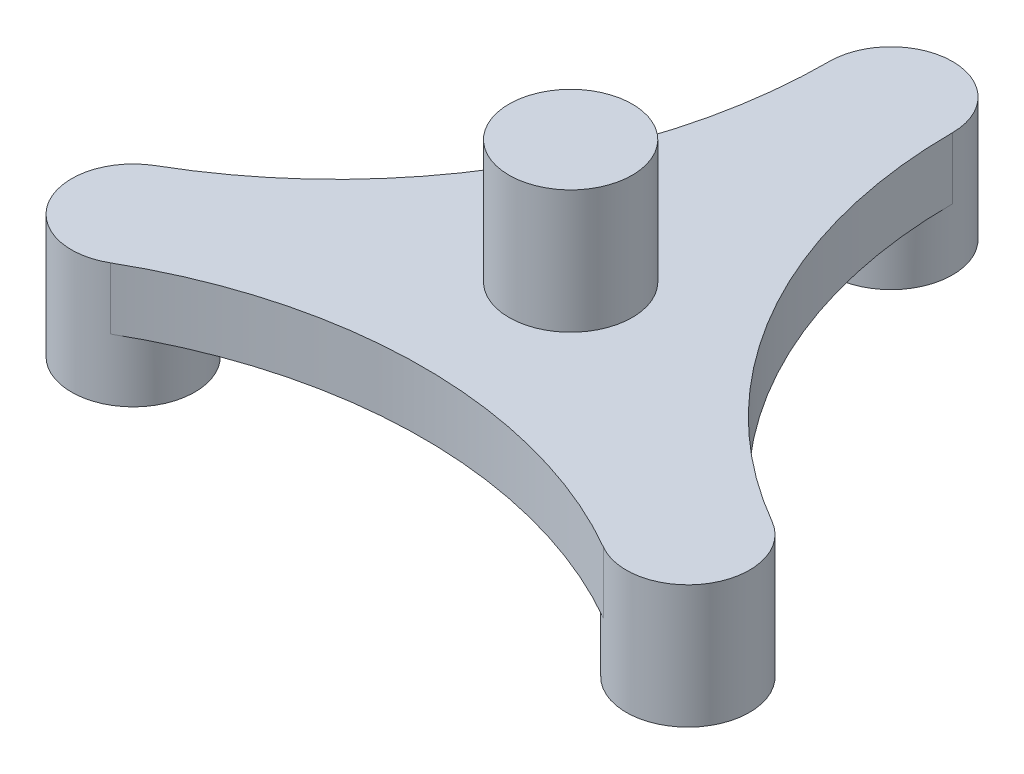
ISO-10303-21;
HEADER;
FILE_DESCRIPTION(('STEP AP214'),'2;1');
FILE_NAME('part.step','',(''),(''),'','','');
FILE_SCHEMA(('AUTOMOTIVE_DESIGN { 1 0 10303 214 1 1 1 1 }'));
ENDSEC;
DATA;
#1=APPLICATION_CONTEXT('core data for automotive mechanical design processes');
#2=APPLICATION_PROTOCOL_DEFINITION('international standard','automotive_design',2000,#1);
#3=PRODUCT_CONTEXT('',#1,'mechanical');
#4=PRODUCT('Part','Part','',(#3));
#5=PRODUCT_RELATED_PRODUCT_CATEGORY('part','',(#4));
#6=PRODUCT_DEFINITION_FORMATION('','',#4);
#7=PRODUCT_DEFINITION_CONTEXT('part definition',#1,'design');
#8=PRODUCT_DEFINITION('design','',#6,#7);
#9=PRODUCT_DEFINITION_SHAPE('','',#8);
#10=(LENGTH_UNIT() NAMED_UNIT(*) SI_UNIT(.MILLI.,.METRE.));
#11=(NAMED_UNIT(*) PLANE_ANGLE_UNIT() SI_UNIT($,.RADIAN.));
#12=(NAMED_UNIT(*) SI_UNIT($,.STERADIAN.) SOLID_ANGLE_UNIT());
#13=UNCERTAINTY_MEASURE_WITH_UNIT(LENGTH_MEASURE(1.E-05),#10,'distance_accuracy_value','');
#14=(GEOMETRIC_REPRESENTATION_CONTEXT(3) GLOBAL_UNCERTAINTY_ASSIGNED_CONTEXT((#13)) GLOBAL_UNIT_ASSIGNED_CONTEXT((#10,
#11,#12)) REPRESENTATION_CONTEXT('',''));
#15=CARTESIAN_POINT('',(0.,0.,0.));
#16=DIRECTION('',(0.,0.,1.));
#17=DIRECTION('',(1.,0.,0.));
#18=AXIS2_PLACEMENT_3D('',#15,#16,#17);
#19=CARTESIAN_POINT('',(-57.15,0.,-65.9911357683742));
#20=DIRECTION('',(0.,1.,0.));
#21=DIRECTION('',(0.,0.,1.));
#22=AXIS2_PLACEMENT_3D('',#19,#20,#21);
#23=PLANE('',#22);
#24=CARTESIAN_POINT('',(0.,0.,-65.9911357683742));
#25=DIRECTION('',(0.,-1.,0.));
#26=DIRECTION('',(0.,0.,-1.));
#27=AXIS2_PLACEMENT_3D('',#24,#25,#26);
#28=CIRCLE('',#27,12.7);
#29=CARTESIAN_POINT('',(12.7,0.,-65.9911357683742));
#30=VERTEX_POINT('',#29);
#31=CARTESIAN_POINT('',(-12.7,0.,-65.9911357683742));
#32=VERTEX_POINT('',#31);
#33=EDGE_CURVE('E77',#30,#32,#28,.T.);
#34=ORIENTED_EDGE('',*,*,#33,.F.);
#35=CARTESIAN_POINT('',(114.3,0.,-65.9911357683742));
#36=DIRECTION('',(0.,-1.,0.));
#37=DIRECTION('',(0.,0.,1.));
#38=AXIS2_PLACEMENT_3D('',#35,#36,#37);
#39=CIRCLE('',#38,101.6);
#40=CARTESIAN_POINT('',(63.4999999999999,0.,21.9970452561247));
#41=VERTEX_POINT('',#40);
#42=EDGE_CURVE('E132',#41,#30,#39,.T.);
#43=ORIENTED_EDGE('',*,*,#42,.F.);
#44=CARTESIAN_POINT('',(57.1499999999999,0.,32.9955678841871));
#45=DIRECTION('',(0.,1.,0.));
#46=DIRECTION('',(0.,0.,1.));
#47=AXIS2_PLACEMENT_3D('',#44,#45,#46);
#48=CIRCLE('',#47,12.7000000000001);
#49=CARTESIAN_POINT('',(50.7999999999999,0.,43.9940905122495));
#50=VERTEX_POINT('',#49);
#51=EDGE_CURVE('E11',#50,#41,#48,.F.);
#52=ORIENTED_EDGE('',*,*,#51,.F.);
#53=CARTESIAN_POINT('',(0.,0.,131.982271536748));
#54=DIRECTION('',(0.,-1.,0.));
#55=DIRECTION('',(0.,0.,1.));
#56=AXIS2_PLACEMENT_3D('',#53,#54,#55);
#57=CIRCLE('',#56,101.6);
#58=CARTESIAN_POINT('',(-50.8,0.,43.9940905122495));
#59=VERTEX_POINT('',#58);
#60=EDGE_CURVE('E127',#59,#50,#57,.T.);
#61=ORIENTED_EDGE('',*,*,#60,.F.);
#62=CARTESIAN_POINT('',(-57.15,0.,32.9955678841871));
#63=DIRECTION('',(0.,-1.,0.));
#64=DIRECTION('',(0.,0.,-1.));
#65=AXIS2_PLACEMENT_3D('',#62,#63,#64);
#66=CIRCLE('',#65,12.7);
#67=CARTESIAN_POINT('',(-63.5,0.,21.9970452561248));
#68=VERTEX_POINT('',#67);
#69=EDGE_CURVE('E49',#68,#59,#66,.T.);
#70=ORIENTED_EDGE('',*,*,#69,.F.);
#71=CARTESIAN_POINT('',(-114.3,0.,-65.9911357683742));
#72=DIRECTION('',(0.,-1.,0.));
#73=DIRECTION('',(0.,0.,1.));
#74=AXIS2_PLACEMENT_3D('',#71,#72,#73);
#75=CIRCLE('',#74,101.6);
#76=EDGE_CURVE('E123',#32,#68,#75,.T.);
#77=ORIENTED_EDGE('',*,*,#76,.F.);
#78=EDGE_LOOP('',(#34,#43,#52,#61,#70,#77));
#79=FACE_BOUND('',#78,.T.);
#80=ADVANCED_FACE('F39',(#79),#23,.F.);
#81=CARTESIAN_POINT('',(-114.3,12.7,-65.9911357683742));
#82=DIRECTION('',(0.,-1.,0.));
#83=DIRECTION('',(0.,0.,-1.));
#84=AXIS2_PLACEMENT_3D('',#81,#82,#83);
#85=CYLINDRICAL_SURFACE('',#84,101.6);
#86=ORIENTED_EDGE('',*,*,#76,.T.);
#87=DIRECTION('',(0.,-1.,0.));
#88=VECTOR('',#87,1.);
#89=CARTESIAN_POINT('',(-63.5,12.7,21.9970452561248));
#90=LINE('',#89,#88);
#91=CARTESIAN_POINT('',(-63.5,12.7,21.9970452561248));
#92=VERTEX_POINT('',#91);
#93=EDGE_CURVE('E145',#92,#68,#90,.T.);
#94=ORIENTED_EDGE('',*,*,#93,.F.);
#95=CARTESIAN_POINT('',(-114.3,12.7,-65.9911357683742));
#96=DIRECTION('',(0.,-1.,0.));
#97=DIRECTION('',(0.,0.,1.));
#98=AXIS2_PLACEMENT_3D('',#95,#96,#97);
#99=CIRCLE('',#98,101.6);
#100=CARTESIAN_POINT('',(-12.7,12.7,-65.9911357683742));
#101=VERTEX_POINT('',#100);
#102=EDGE_CURVE('E135',#101,#92,#99,.T.);
#103=ORIENTED_EDGE('',*,*,#102,.F.);
#104=DIRECTION('',(0.,-1.,0.));
#105=VECTOR('',#104,1.);
#106=CARTESIAN_POINT('',(-12.7,12.7,-65.9911357683742));
#107=LINE('',#106,#105);
#108=EDGE_CURVE('E119',#101,#32,#107,.T.);
#109=ORIENTED_EDGE('',*,*,#108,.T.);
#110=EDGE_LOOP('',(#86,#94,#103,#109));
#111=FACE_BOUND('',#110,.T.);
#112=ADVANCED_FACE('F41',(#111),#85,.F.);
#113=CARTESIAN_POINT('',(-57.15,12.7,32.9955678841871));
#114=DIRECTION('',(0.,-1.,0.));
#115=DIRECTION('',(0.,0.,-1.));
#116=AXIS2_PLACEMENT_3D('',#113,#114,#115);
#117=CYLINDRICAL_SURFACE('',#116,12.7);
#118=ORIENTED_EDGE('',*,*,#93,.T.);
#119=ORIENTED_EDGE('',*,*,#69,.T.);
#120=DIRECTION('',(0.,-1.,0.));
#121=VECTOR('',#120,1.);
#122=CARTESIAN_POINT('',(-50.8,12.7,43.9940905122495));
#123=LINE('',#122,#121);
#124=CARTESIAN_POINT('',(-50.8,12.7,43.9940905122495));
#125=VERTEX_POINT('',#124);
#126=EDGE_CURVE('E142',#125,#59,#123,.T.);
#127=ORIENTED_EDGE('',*,*,#126,.F.);
#128=CARTESIAN_POINT('',(-57.15,12.7,32.9955678841871));
#129=DIRECTION('',(0.,1.,0.));
#130=DIRECTION('',(0.,0.,-1.));
#131=AXIS2_PLACEMENT_3D('',#128,#129,#130);
#132=CIRCLE('',#131,12.7);
#133=EDGE_CURVE('E86',#92,#125,#132,.T.);
#134=ORIENTED_EDGE('',*,*,#133,.F.);
#135=EDGE_LOOP('',(#118,#119,#127,#134));
#136=FACE_BOUND('',#135,.T.);
#137=CARTESIAN_POINT('',(-57.15,-12.7,32.9955678841871));
#138=DIRECTION('',(0.,-1.,0.));
#139=DIRECTION('',(0.,0.,-1.));
#140=AXIS2_PLACEMENT_3D('',#137,#138,#139);
#141=CIRCLE('',#140,12.7);
#142=CARTESIAN_POINT('',(-57.15,-12.7,20.2955678841871));
#143=VERTEX_POINT('',#142);
#144=EDGE_CURVE('E166',#143,#143,#141,.T.);
#145=ORIENTED_EDGE('',*,*,#144,.F.);
#146=EDGE_LOOP('',(#145));
#147=FACE_BOUND('',#146,.T.);
#148=ADVANCED_FACE('F200',(#136,#147),#117,.T.);
#149=CARTESIAN_POINT('',(0.,12.7,131.982271536748));
#150=DIRECTION('',(0.,-1.,0.));
#151=DIRECTION('',(0.,0.,-1.));
#152=AXIS2_PLACEMENT_3D('',#149,#150,#151);
#153=CYLINDRICAL_SURFACE('',#152,101.6);
#154=ORIENTED_EDGE('',*,*,#60,.T.);
#155=DIRECTION('',(0.,-1.,0.));
#156=VECTOR('',#155,1.);
#157=CARTESIAN_POINT('',(50.8,12.7,43.9940905122495));
#158=LINE('',#157,#156);
#159=CARTESIAN_POINT('',(50.8,12.7,43.9940905122495));
#160=VERTEX_POINT('',#159);
#161=EDGE_CURVE('E112',#160,#50,#158,.T.);
#162=ORIENTED_EDGE('',*,*,#161,.F.);
#163=CARTESIAN_POINT('',(0.,12.7,131.982271536748));
#164=DIRECTION('',(0.,-1.,0.));
#165=DIRECTION('',(0.,0.,1.));
#166=AXIS2_PLACEMENT_3D('',#163,#164,#165);
#167=CIRCLE('',#166,101.6);
#168=EDGE_CURVE('E101',#125,#160,#167,.T.);
#169=ORIENTED_EDGE('',*,*,#168,.F.);
#170=ORIENTED_EDGE('',*,*,#126,.T.);
#171=EDGE_LOOP('',(#154,#162,#169,#170));
#172=FACE_BOUND('',#171,.T.);
#173=ADVANCED_FACE('F266',(#172),#153,.F.);
#174=CARTESIAN_POINT('',(57.15,12.7,32.9955678841871));
#175=DIRECTION('',(0.,-1.,0.));
#176=DIRECTION('',(0.,0.,-1.));
#177=AXIS2_PLACEMENT_3D('',#174,#175,#176);
#178=CYLINDRICAL_SURFACE('',#177,12.7);
#179=ORIENTED_EDGE('',*,*,#161,.T.);
#180=ORIENTED_EDGE('',*,*,#51,.T.);
#181=DIRECTION('',(0.,-1.,0.));
#182=VECTOR('',#181,1.);
#183=CARTESIAN_POINT('',(63.4999999999999,12.7,21.9970452561247));
#184=LINE('',#183,#182);
#185=CARTESIAN_POINT('',(63.4999999999999,12.7,21.9970452561247));
#186=VERTEX_POINT('',#185);
#187=EDGE_CURVE('E105',#186,#41,#184,.T.);
#188=ORIENTED_EDGE('',*,*,#187,.F.);
#189=CARTESIAN_POINT('',(57.15,12.7,32.9955678841871));
#190=DIRECTION('',(0.,1.,0.));
#191=DIRECTION('',(0.,0.,-1.));
#192=AXIS2_PLACEMENT_3D('',#189,#190,#191);
#193=CIRCLE('',#192,12.7);
#194=EDGE_CURVE('E95',#160,#186,#193,.T.);
#195=ORIENTED_EDGE('',*,*,#194,.F.);
#196=EDGE_LOOP('',(#179,#180,#188,#195));
#197=FACE_BOUND('',#196,.T.);
#198=CARTESIAN_POINT('',(57.1499999999999,-12.7,32.9955678841871));
#199=DIRECTION('',(0.,-1.,0.));
#200=DIRECTION('',(0.,0.,-1.));
#201=AXIS2_PLACEMENT_3D('',#198,#199,#200);
#202=CIRCLE('',#201,12.7000000000001);
#203=CARTESIAN_POINT('',(57.1499999999999,-12.7,20.295567884187));
#204=VERTEX_POINT('',#203);
#205=EDGE_CURVE('E169',#204,#204,#202,.T.);
#206=ORIENTED_EDGE('',*,*,#205,.F.);
#207=EDGE_LOOP('',(#206));
#208=FACE_BOUND('',#207,.T.);
#209=ADVANCED_FACE('F106',(#197,#208),#178,.T.);
#210=CARTESIAN_POINT('',(114.3,12.7,-65.9911357683742));
#211=DIRECTION('',(0.,-1.,0.));
#212=DIRECTION('',(0.,0.,-1.));
#213=AXIS2_PLACEMENT_3D('',#210,#211,#212);
#214=CYLINDRICAL_SURFACE('',#213,101.6);
#215=ORIENTED_EDGE('',*,*,#42,.T.);
#216=DIRECTION('',(0.,-1.,0.));
#217=VECTOR('',#216,1.);
#218=CARTESIAN_POINT('',(12.6999999999999,12.7,-65.9911357683742));
#219=LINE('',#218,#217);
#220=CARTESIAN_POINT('',(12.6999999999999,12.7,-65.9911357683742));
#221=VERTEX_POINT('',#220);
#222=EDGE_CURVE('E113',#221,#30,#219,.T.);
#223=ORIENTED_EDGE('',*,*,#222,.F.);
#224=CARTESIAN_POINT('',(114.3,12.7,-65.9911357683742));
#225=DIRECTION('',(0.,-1.,0.));
#226=DIRECTION('',(0.,0.,1.));
#227=AXIS2_PLACEMENT_3D('',#224,#225,#226);
#228=CIRCLE('',#227,101.6);
#229=EDGE_CURVE('E98',#186,#221,#228,.T.);
#230=ORIENTED_EDGE('',*,*,#229,.F.);
#231=ORIENTED_EDGE('',*,*,#187,.T.);
#232=EDGE_LOOP('',(#215,#223,#230,#231));
#233=FACE_BOUND('',#232,.T.);
#234=ADVANCED_FACE('F115',(#233),#214,.F.);
#235=CARTESIAN_POINT('',(0.,12.7,-65.9911357683742));
#236=DIRECTION('',(0.,-1.,0.));
#237=DIRECTION('',(0.,0.,-1.));
#238=AXIS2_PLACEMENT_3D('',#235,#236,#237);
#239=CYLINDRICAL_SURFACE('',#238,12.7);
#240=ORIENTED_EDGE('',*,*,#222,.T.);
#241=ORIENTED_EDGE('',*,*,#33,.T.);
#242=ORIENTED_EDGE('',*,*,#108,.F.);
#243=CARTESIAN_POINT('',(0.,12.7,-65.9911357683742));
#244=DIRECTION('',(0.,1.,0.));
#245=DIRECTION('',(0.,0.,-1.));
#246=AXIS2_PLACEMENT_3D('',#243,#244,#245);
#247=CIRCLE('',#246,12.7);
#248=EDGE_CURVE('E57',#221,#101,#247,.T.);
#249=ORIENTED_EDGE('',*,*,#248,.F.);
#250=EDGE_LOOP('',(#240,#241,#242,#249));
#251=FACE_BOUND('',#250,.T.);
#252=CARTESIAN_POINT('',(0.,-12.7,-65.9911357683742));
#253=DIRECTION('',(0.,-1.,0.));
#254=DIRECTION('',(0.,0.,-1.));
#255=AXIS2_PLACEMENT_3D('',#252,#253,#254);
#256=CIRCLE('',#255,12.7);
#257=CARTESIAN_POINT('',(0.,-12.7,-78.6911357683742));
#258=VERTEX_POINT('',#257);
#259=EDGE_CURVE('E173',#258,#258,#256,.T.);
#260=ORIENTED_EDGE('',*,*,#259,.F.);
#261=EDGE_LOOP('',(#260));
#262=FACE_BOUND('',#261,.T.);
#263=ADVANCED_FACE('F183',(#251,#262),#239,.T.);
#264=CARTESIAN_POINT('',(-57.15,12.7,-65.9911357683742));
#265=DIRECTION('',(0.,1.,0.));
#266=DIRECTION('',(0.,0.,1.));
#267=AXIS2_PLACEMENT_3D('',#264,#265,#266);
#268=PLANE('',#267);
#269=CARTESIAN_POINT('',(0.,12.7,0.));
#270=DIRECTION('',(0.,1.,0.));
#271=DIRECTION('',(0.,0.,1.));
#272=AXIS2_PLACEMENT_3D('',#269,#270,#271);
#273=CIRCLE('',#272,12.7);
#274=CARTESIAN_POINT('',(0.,12.7,12.7));
#275=VERTEX_POINT('',#274);
#276=EDGE_CURVE('E147',#275,#275,#273,.T.);
#277=ORIENTED_EDGE('',*,*,#276,.F.);
#278=EDGE_LOOP('',(#277));
#279=FACE_BOUND('',#278,.T.);
#280=ORIENTED_EDGE('',*,*,#102,.T.);
#281=ORIENTED_EDGE('',*,*,#133,.T.);
#282=ORIENTED_EDGE('',*,*,#168,.T.);
#283=ORIENTED_EDGE('',*,*,#194,.T.);
#284=ORIENTED_EDGE('',*,*,#229,.T.);
#285=ORIENTED_EDGE('',*,*,#248,.T.);
#286=EDGE_LOOP('',(#280,#281,#282,#283,#284,#285));
#287=FACE_BOUND('',#286,.T.);
#288=ADVANCED_FACE('F96',(#279,#287),#268,.T.);
#289=CARTESIAN_POINT('',(0.,38.1,0.));
#290=DIRECTION('',(0.,-1.,0.));
#291=DIRECTION('',(0.,0.,-1.));
#292=AXIS2_PLACEMENT_3D('',#289,#290,#291);
#293=CYLINDRICAL_SURFACE('',#292,12.7);
#294=CARTESIAN_POINT('',(0.,38.1,0.));
#295=DIRECTION('',(0.,1.,0.));
#296=DIRECTION('',(0.,0.,1.));
#297=AXIS2_PLACEMENT_3D('',#294,#295,#296);
#298=CIRCLE('',#297,12.7);
#299=CARTESIAN_POINT('',(0.,38.1,12.7));
#300=VERTEX_POINT('',#299);
#301=EDGE_CURVE('E128',#300,#300,#298,.T.);
#302=ORIENTED_EDGE('',*,*,#301,.F.);
#303=EDGE_LOOP('',(#302));
#304=FACE_BOUND('',#303,.T.);
#305=ORIENTED_EDGE('',*,*,#276,.T.);
#306=EDGE_LOOP('',(#305));
#307=FACE_BOUND('',#306,.T.);
#308=ADVANCED_FACE('F190',(#304,#307),#293,.T.);
#309=CARTESIAN_POINT('',(0.,38.1,0.));
#310=DIRECTION('',(0.,1.,0.));
#311=DIRECTION('',(0.,0.,1.));
#312=AXIS2_PLACEMENT_3D('',#309,#310,#311);
#313=PLANE('',#312);
#314=ORIENTED_EDGE('',*,*,#301,.T.);
#315=EDGE_LOOP('',(#314));
#316=FACE_BOUND('',#315,.T.);
#317=ADVANCED_FACE('F205',(#316),#313,.T.);
#318=CARTESIAN_POINT('',(-57.15,-12.7,32.9955678841871));
#319=DIRECTION('',(0.,-1.,0.));
#320=DIRECTION('',(0.,0.,-1.));
#321=AXIS2_PLACEMENT_3D('',#318,#319,#320);
#322=PLANE('',#321);
#323=ORIENTED_EDGE('',*,*,#144,.T.);
#324=EDGE_LOOP('',(#323));
#325=FACE_BOUND('',#324,.T.);
#326=ADVANCED_FACE('F209',(#325),#322,.T.);
#327=CARTESIAN_POINT('',(57.1499999999999,-12.7,32.9955678841871));
#328=DIRECTION('',(0.,-1.,0.));
#329=DIRECTION('',(0.,0.,-1.));
#330=AXIS2_PLACEMENT_3D('',#327,#328,#329);
#331=PLANE('',#330);
#332=ORIENTED_EDGE('',*,*,#205,.T.);
#333=EDGE_LOOP('',(#332));
#334=FACE_BOUND('',#333,.T.);
#335=ADVANCED_FACE('F213',(#334),#331,.T.);
#336=CARTESIAN_POINT('',(0.,-12.7,-65.9911357683742));
#337=DIRECTION('',(0.,-1.,0.));
#338=DIRECTION('',(0.,0.,-1.));
#339=AXIS2_PLACEMENT_3D('',#336,#337,#338);
#340=PLANE('',#339);
#341=ORIENTED_EDGE('',*,*,#259,.T.);
#342=EDGE_LOOP('',(#341));
#343=FACE_BOUND('',#342,.T.);
#344=ADVANCED_FACE('F181',(#343),#340,.T.);
#345=CLOSED_SHELL('',(#80,#112,#148,#173,#209,#234,#263,#288,#308,#317,#326,#335,#344));
#346=MANIFOLD_SOLID_BREP('B2',#345);
#347=ADVANCED_BREP_SHAPE_REPRESENTATION('',(#18,#346),#14);
#348=SHAPE_DEFINITION_REPRESENTATION(#9,#347);
ENDSEC;
END-ISO-10303-21;
